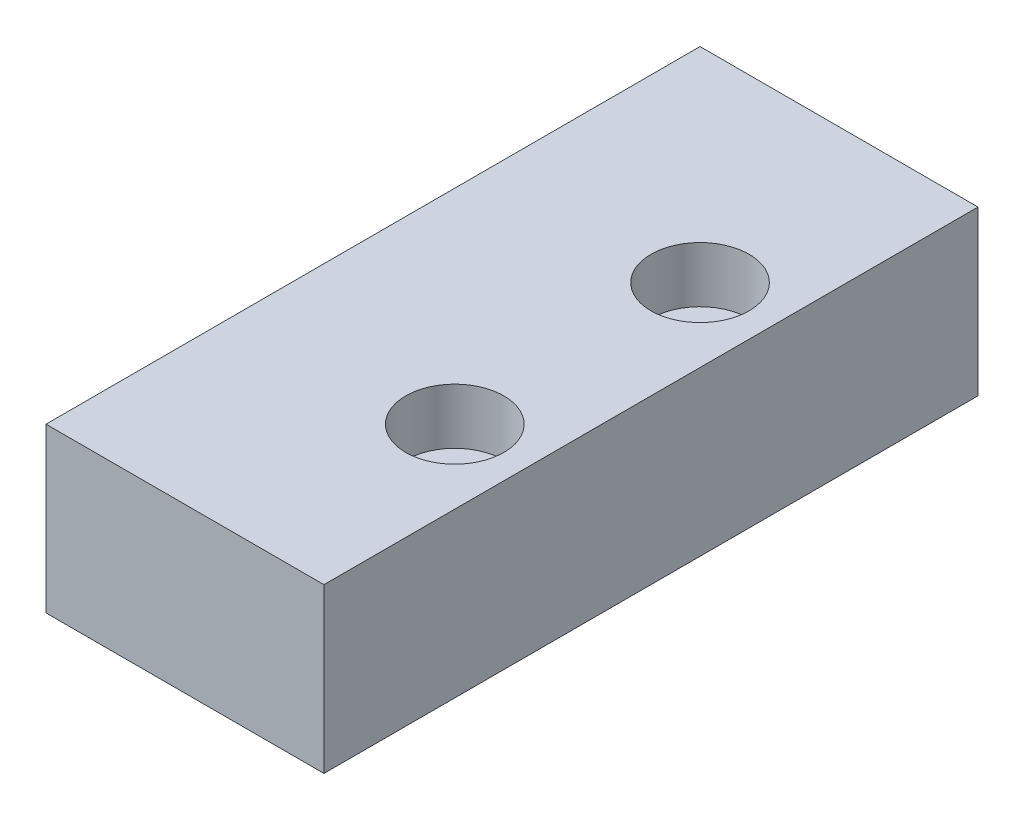
ISO-10303-21;
HEADER;
FILE_DESCRIPTION(('STEP AP214'),'2;1');
FILE_NAME('part.step','',(''),(''),'','','');
FILE_SCHEMA(('AUTOMOTIVE_DESIGN { 1 0 10303 214 1 1 1 1 }'));
ENDSEC;
DATA;
#1=APPLICATION_CONTEXT('core data for automotive mechanical design processes');
#2=APPLICATION_PROTOCOL_DEFINITION('international standard','automotive_design',2000,#1);
#3=PRODUCT_CONTEXT('',#1,'mechanical');
#4=PRODUCT('Part','Part','',(#3));
#5=PRODUCT_RELATED_PRODUCT_CATEGORY('part','',(#4));
#6=PRODUCT_DEFINITION_FORMATION('','',#4);
#7=PRODUCT_DEFINITION_CONTEXT('part definition',#1,'design');
#8=PRODUCT_DEFINITION('design','',#6,#7);
#9=PRODUCT_DEFINITION_SHAPE('','',#8);
#10=(LENGTH_UNIT() NAMED_UNIT(*) SI_UNIT(.MILLI.,.METRE.));
#11=(NAMED_UNIT(*) PLANE_ANGLE_UNIT() SI_UNIT($,.RADIAN.));
#12=(NAMED_UNIT(*) SI_UNIT($,.STERADIAN.) SOLID_ANGLE_UNIT());
#13=UNCERTAINTY_MEASURE_WITH_UNIT(LENGTH_MEASURE(1.E-05),#10,'distance_accuracy_value','');
#14=(GEOMETRIC_REPRESENTATION_CONTEXT(3) GLOBAL_UNCERTAINTY_ASSIGNED_CONTEXT((#13)) GLOBAL_UNIT_ASSIGNED_CONTEXT((#10,
#11,#12)) REPRESENTATION_CONTEXT('',''));
#15=CARTESIAN_POINT('',(0.,0.,0.));
#16=DIRECTION('',(0.,0.,1.));
#17=DIRECTION('',(1.,0.,0.));
#18=AXIS2_PLACEMENT_3D('',#15,#16,#17);
#19=CARTESIAN_POINT('',(0.,10.,0.));
#20=DIRECTION('',(-1.,0.,0.));
#21=DIRECTION('',(0.,0.,1.));
#22=AXIS2_PLACEMENT_3D('',#19,#20,#21);
#23=PLANE('',#22);
#24=DIRECTION('',(0.,0.,-1.));
#25=VECTOR('',#24,1.);
#26=CARTESIAN_POINT('',(0.,0.,0.));
#27=LINE('',#26,#25);
#28=CARTESIAN_POINT('',(0.,0.,20.));
#29=VERTEX_POINT('',#28);
#30=CARTESIAN_POINT('',(0.,0.,-20.));
#31=VERTEX_POINT('',#30);
#32=EDGE_CURVE('E76',#29,#31,#27,.T.);
#33=ORIENTED_EDGE('',*,*,#32,.T.);
#34=DIRECTION('',(0.,-1.,0.));
#35=VECTOR('',#34,1.);
#36=CARTESIAN_POINT('',(0.,10.,-20.));
#37=LINE('',#36,#35);
#38=CARTESIAN_POINT('',(0.,10.,-20.));
#39=VERTEX_POINT('',#38);
#40=EDGE_CURVE('E11',#39,#31,#37,.T.);
#41=ORIENTED_EDGE('',*,*,#40,.F.);
#42=DIRECTION('',(0.,0.,-1.));
#43=VECTOR('',#42,1.);
#44=CARTESIAN_POINT('',(0.,10.,20.));
#45=LINE('',#44,#43);
#46=CARTESIAN_POINT('',(0.,10.,20.));
#47=VERTEX_POINT('',#46);
#48=EDGE_CURVE('E81',#47,#39,#45,.T.);
#49=ORIENTED_EDGE('',*,*,#48,.F.);
#50=DIRECTION('',(0.,-1.,0.));
#51=VECTOR('',#50,1.);
#52=CARTESIAN_POINT('',(0.,10.,20.));
#53=LINE('',#52,#51);
#54=EDGE_CURVE('E150',#47,#29,#53,.T.);
#55=ORIENTED_EDGE('',*,*,#54,.T.);
#56=EDGE_LOOP('',(#33,#41,#49,#55));
#57=FACE_BOUND('',#56,.T.);
#58=ADVANCED_FACE('F35',(#57),#23,.F.);
#59=CARTESIAN_POINT('',(0.,10.,-20.));
#60=DIRECTION('',(0.,0.,1.));
#61=DIRECTION('',(1.,0.,0.));
#62=AXIS2_PLACEMENT_3D('',#59,#60,#61);
#63=PLANE('',#62);
#64=DIRECTION('',(-1.,0.,0.));
#65=VECTOR('',#64,1.);
#66=CARTESIAN_POINT('',(0.,0.,-20.));
#67=LINE('',#66,#65);
#68=CARTESIAN_POINT('',(-17.,0.,-20.));
#69=VERTEX_POINT('',#68);
#70=EDGE_CURVE('E152',#31,#69,#67,.T.);
#71=ORIENTED_EDGE('',*,*,#70,.T.);
#72=DIRECTION('',(0.,-1.,0.));
#73=VECTOR('',#72,1.);
#74=CARTESIAN_POINT('',(-17.,10.,-20.));
#75=LINE('',#74,#73);
#76=CARTESIAN_POINT('',(-17.,10.,-20.));
#77=VERTEX_POINT('',#76);
#78=EDGE_CURVE('E43',#77,#69,#75,.T.);
#79=ORIENTED_EDGE('',*,*,#78,.F.);
#80=DIRECTION('',(-1.,0.,0.));
#81=VECTOR('',#80,1.);
#82=CARTESIAN_POINT('',(0.,10.,-20.));
#83=LINE('',#82,#81);
#84=EDGE_CURVE('E144',#39,#77,#83,.T.);
#85=ORIENTED_EDGE('',*,*,#84,.F.);
#86=ORIENTED_EDGE('',*,*,#40,.T.);
#87=EDGE_LOOP('',(#71,#79,#85,#86));
#88=FACE_BOUND('',#87,.T.);
#89=ADVANCED_FACE('F168',(#88),#63,.F.);
#90=CARTESIAN_POINT('',(-17.,10.,-20.));
#91=DIRECTION('',(1.,0.,0.));
#92=DIRECTION('',(0.,0.,-1.));
#93=AXIS2_PLACEMENT_3D('',#90,#91,#92);
#94=PLANE('',#93);
#95=CARTESIAN_POINT('',(-17.,5.,-12.));
#96=DIRECTION('',(-1.,0.,0.));
#97=DIRECTION('',(0.,0.,1.));
#98=AXIS2_PLACEMENT_3D('',#95,#96,#97);
#99=CIRCLE('',#98,1.24999999999999);
#100=CARTESIAN_POINT('',(-17.,5.,-10.75));
#101=VERTEX_POINT('',#100);
#102=EDGE_CURVE('E103',#101,#101,#99,.T.);
#103=ORIENTED_EDGE('',*,*,#102,.F.);
#104=EDGE_LOOP('',(#103));
#105=FACE_BOUND('',#104,.T.);
#106=CARTESIAN_POINT('',(-17.,5.,0.));
#107=DIRECTION('',(-1.,0.,0.));
#108=DIRECTION('',(0.,0.,1.));
#109=AXIS2_PLACEMENT_3D('',#106,#107,#108);
#110=CIRCLE('',#109,1.24999999999999);
#111=CARTESIAN_POINT('',(-17.,5.,1.24999999999999));
#112=VERTEX_POINT('',#111);
#113=EDGE_CURVE('E102',#112,#112,#110,.T.);
#114=ORIENTED_EDGE('',*,*,#113,.F.);
#115=EDGE_LOOP('',(#114));
#116=FACE_BOUND('',#115,.T.);
#117=CARTESIAN_POINT('',(-17.,5.,12.));
#118=DIRECTION('',(-1.,0.,0.));
#119=DIRECTION('',(0.,0.,1.));
#120=AXIS2_PLACEMENT_3D('',#117,#118,#119);
#121=CIRCLE('',#120,1.24999999999999);
#122=CARTESIAN_POINT('',(-17.,5.,13.25));
#123=VERTEX_POINT('',#122);
#124=EDGE_CURVE('E113',#123,#123,#121,.T.);
#125=ORIENTED_EDGE('',*,*,#124,.F.);
#126=EDGE_LOOP('',(#125));
#127=FACE_BOUND('',#126,.T.);
#128=DIRECTION('',(0.,0.,1.));
#129=VECTOR('',#128,1.);
#130=CARTESIAN_POINT('',(-17.,0.,-20.));
#131=LINE('',#130,#129);
#132=CARTESIAN_POINT('',(-17.,0.,20.));
#133=VERTEX_POINT('',#132);
#134=EDGE_CURVE('E69',#69,#133,#131,.T.);
#135=ORIENTED_EDGE('',*,*,#134,.T.);
#136=DIRECTION('',(0.,-1.,0.));
#137=VECTOR('',#136,1.);
#138=CARTESIAN_POINT('',(-17.,10.,20.));
#139=LINE('',#138,#137);
#140=CARTESIAN_POINT('',(-17.,10.,20.));
#141=VERTEX_POINT('',#140);
#142=EDGE_CURVE('E158',#141,#133,#139,.T.);
#143=ORIENTED_EDGE('',*,*,#142,.F.);
#144=DIRECTION('',(0.,0.,1.));
#145=VECTOR('',#144,1.);
#146=CARTESIAN_POINT('',(-17.,10.,-20.));
#147=LINE('',#146,#145);
#148=EDGE_CURVE('E147',#77,#141,#147,.T.);
#149=ORIENTED_EDGE('',*,*,#148,.F.);
#150=ORIENTED_EDGE('',*,*,#78,.T.);
#151=EDGE_LOOP('',(#135,#143,#149,#150));
#152=FACE_BOUND('',#151,.T.);
#153=ADVANCED_FACE('F161',(#105,#116,#127,#152),#94,.F.);
#154=CARTESIAN_POINT('',(-17.,10.,20.));
#155=DIRECTION('',(0.,0.,-1.));
#156=DIRECTION('',(-1.,0.,0.));
#157=AXIS2_PLACEMENT_3D('',#154,#155,#156);
#158=PLANE('',#157);
#159=DIRECTION('',(1.,0.,0.));
#160=VECTOR('',#159,1.);
#161=CARTESIAN_POINT('',(-17.,0.,20.));
#162=LINE('',#161,#160);
#163=EDGE_CURVE('E145',#133,#29,#162,.T.);
#164=ORIENTED_EDGE('',*,*,#163,.T.);
#165=ORIENTED_EDGE('',*,*,#54,.F.);
#166=DIRECTION('',(1.,0.,0.));
#167=VECTOR('',#166,1.);
#168=CARTESIAN_POINT('',(-17.,10.,20.));
#169=LINE('',#168,#167);
#170=EDGE_CURVE('E51',#141,#47,#169,.T.);
#171=ORIENTED_EDGE('',*,*,#170,.F.);
#172=ORIENTED_EDGE('',*,*,#142,.T.);
#173=EDGE_LOOP('',(#164,#165,#171,#172));
#174=FACE_BOUND('',#173,.T.);
#175=ADVANCED_FACE('F166',(#174),#158,.F.);
#176=CARTESIAN_POINT('',(0.,10.,0.));
#177=DIRECTION('',(0.,1.,0.));
#178=DIRECTION('',(0.,0.,1.));
#179=AXIS2_PLACEMENT_3D('',#176,#177,#178);
#180=PLANE('',#179);
#181=CARTESIAN_POINT('',(-4.5,10.,-7.5));
#182=DIRECTION('',(0.,1.,0.));
#183=DIRECTION('',(0.,0.,1.));
#184=AXIS2_PLACEMENT_3D('',#181,#182,#183);
#185=CIRCLE('',#184,3.);
#186=CARTESIAN_POINT('',(-4.5,10.,-4.5));
#187=VERTEX_POINT('',#186);
#188=EDGE_CURVE('E119',#187,#187,#185,.T.);
#189=ORIENTED_EDGE('',*,*,#188,.F.);
#190=EDGE_LOOP('',(#189));
#191=FACE_BOUND('',#190,.T.);
#192=CARTESIAN_POINT('',(-4.5,10.,7.5));
#193=DIRECTION('',(0.,1.,0.));
#194=DIRECTION('',(0.,0.,1.));
#195=AXIS2_PLACEMENT_3D('',#192,#193,#194);
#196=CIRCLE('',#195,3.);
#197=CARTESIAN_POINT('',(-4.5,10.,10.5));
#198=VERTEX_POINT('',#197);
#199=EDGE_CURVE('E131',#198,#198,#196,.T.);
#200=ORIENTED_EDGE('',*,*,#199,.F.);
#201=EDGE_LOOP('',(#200));
#202=FACE_BOUND('',#201,.T.);
#203=ORIENTED_EDGE('',*,*,#48,.T.);
#204=ORIENTED_EDGE('',*,*,#84,.T.);
#205=ORIENTED_EDGE('',*,*,#148,.T.);
#206=ORIENTED_EDGE('',*,*,#170,.T.);
#207=EDGE_LOOP('',(#203,#204,#205,#206));
#208=FACE_BOUND('',#207,.T.);
#209=ADVANCED_FACE('F169',(#191,#202,#208),#180,.T.);
#210=CARTESIAN_POINT('',(0.,0.,0.));
#211=DIRECTION('',(0.,1.,0.));
#212=DIRECTION('',(0.,0.,1.));
#213=AXIS2_PLACEMENT_3D('',#210,#211,#212);
#214=PLANE('',#213);
#215=CARTESIAN_POINT('',(-4.5,0.,-7.5));
#216=DIRECTION('',(0.,1.,0.));
#217=DIRECTION('',(0.,0.,1.));
#218=AXIS2_PLACEMENT_3D('',#215,#216,#217);
#219=CIRCLE('',#218,1.7);
#220=CARTESIAN_POINT('',(-4.5,0.,-5.8));
#221=VERTEX_POINT('',#220);
#222=EDGE_CURVE('E128',#221,#221,#219,.T.);
#223=ORIENTED_EDGE('',*,*,#222,.T.);
#224=EDGE_LOOP('',(#223));
#225=FACE_BOUND('',#224,.T.);
#226=CARTESIAN_POINT('',(-4.5,0.,7.5));
#227=DIRECTION('',(0.,1.,0.));
#228=DIRECTION('',(0.,0.,1.));
#229=AXIS2_PLACEMENT_3D('',#226,#227,#228);
#230=CIRCLE('',#229,1.7);
#231=CARTESIAN_POINT('',(-4.5,0.,9.2));
#232=VERTEX_POINT('',#231);
#233=EDGE_CURVE('E140',#232,#232,#230,.T.);
#234=ORIENTED_EDGE('',*,*,#233,.T.);
#235=EDGE_LOOP('',(#234));
#236=FACE_BOUND('',#235,.T.);
#237=ORIENTED_EDGE('',*,*,#32,.F.);
#238=ORIENTED_EDGE('',*,*,#163,.F.);
#239=ORIENTED_EDGE('',*,*,#134,.F.);
#240=ORIENTED_EDGE('',*,*,#70,.F.);
#241=EDGE_LOOP('',(#237,#238,#239,#240));
#242=FACE_BOUND('',#241,.T.);
#243=ADVANCED_FACE('F164',(#225,#236,#242),#214,.F.);
#244=CARTESIAN_POINT('',(-4.5,10.,7.5));
#245=DIRECTION('',(0.,1.,0.));
#246=DIRECTION('',(0.,0.,1.));
#247=AXIS2_PLACEMENT_3D('',#244,#245,#246);
#248=CYLINDRICAL_SURFACE('',#247,1.7);
#249=ORIENTED_EDGE('',*,*,#233,.F.);
#250=EDGE_LOOP('',(#249));
#251=FACE_BOUND('',#250,.T.);
#252=CARTESIAN_POINT('',(-4.5,6.6,7.5));
#253=DIRECTION('',(0.,1.,0.));
#254=DIRECTION('',(0.,0.,1.));
#255=AXIS2_PLACEMENT_3D('',#252,#253,#254);
#256=CIRCLE('',#255,1.7);
#257=CARTESIAN_POINT('',(-4.5,6.6,9.2));
#258=VERTEX_POINT('',#257);
#259=EDGE_CURVE('E137',#258,#258,#256,.T.);
#260=ORIENTED_EDGE('',*,*,#259,.T.);
#261=EDGE_LOOP('',(#260));
#262=FACE_BOUND('',#261,.T.);
#263=ADVANCED_FACE('F177',(#251,#262),#248,.F.);
#264=CARTESIAN_POINT('',(-2.8,6.6,7.5));
#265=DIRECTION('',(0.,-1.,0.));
#266=DIRECTION('',(0.,0.,-1.));
#267=AXIS2_PLACEMENT_3D('',#264,#265,#266);
#268=PLANE('',#267);
#269=ORIENTED_EDGE('',*,*,#259,.F.);
#270=EDGE_LOOP('',(#269));
#271=FACE_BOUND('',#270,.T.);
#272=CARTESIAN_POINT('',(-4.5,6.6,7.5));
#273=DIRECTION('',(0.,1.,0.));
#274=DIRECTION('',(0.,0.,1.));
#275=AXIS2_PLACEMENT_3D('',#272,#273,#274);
#276=CIRCLE('',#275,3.);
#277=CARTESIAN_POINT('',(-4.5,6.6,10.5));
#278=VERTEX_POINT('',#277);
#279=EDGE_CURVE('E134',#278,#278,#276,.T.);
#280=ORIENTED_EDGE('',*,*,#279,.T.);
#281=EDGE_LOOP('',(#280));
#282=FACE_BOUND('',#281,.T.);
#283=ADVANCED_FACE('F233',(#271,#282),#268,.F.);
#284=CARTESIAN_POINT('',(-4.5,10.,7.5));
#285=DIRECTION('',(0.,1.,0.));
#286=DIRECTION('',(0.,0.,1.));
#287=AXIS2_PLACEMENT_3D('',#284,#285,#286);
#288=CYLINDRICAL_SURFACE('',#287,3.);
#289=ORIENTED_EDGE('',*,*,#279,.F.);
#290=EDGE_LOOP('',(#289));
#291=FACE_BOUND('',#290,.T.);
#292=ORIENTED_EDGE('',*,*,#199,.T.);
#293=EDGE_LOOP('',(#292));
#294=FACE_BOUND('',#293,.T.);
#295=ADVANCED_FACE('F229',(#291,#294),#288,.F.);
#296=CARTESIAN_POINT('',(-4.5,10.,-7.5));
#297=DIRECTION('',(0.,1.,0.));
#298=DIRECTION('',(0.,0.,1.));
#299=AXIS2_PLACEMENT_3D('',#296,#297,#298);
#300=CYLINDRICAL_SURFACE('',#299,1.7);
#301=ORIENTED_EDGE('',*,*,#222,.F.);
#302=EDGE_LOOP('',(#301));
#303=FACE_BOUND('',#302,.T.);
#304=CARTESIAN_POINT('',(-4.5,6.6,-7.5));
#305=DIRECTION('',(0.,1.,0.));
#306=DIRECTION('',(0.,0.,1.));
#307=AXIS2_PLACEMENT_3D('',#304,#305,#306);
#308=CIRCLE('',#307,1.7);
#309=CARTESIAN_POINT('',(-4.5,6.6,-5.8));
#310=VERTEX_POINT('',#309);
#311=EDGE_CURVE('E125',#310,#310,#308,.T.);
#312=ORIENTED_EDGE('',*,*,#311,.T.);
#313=EDGE_LOOP('',(#312));
#314=FACE_BOUND('',#313,.T.);
#315=ADVANCED_FACE('F225',(#303,#314),#300,.F.);
#316=CARTESIAN_POINT('',(-2.8,6.6,-7.5));
#317=DIRECTION('',(0.,-1.,0.));
#318=DIRECTION('',(0.,0.,-1.));
#319=AXIS2_PLACEMENT_3D('',#316,#317,#318);
#320=PLANE('',#319);
#321=ORIENTED_EDGE('',*,*,#311,.F.);
#322=EDGE_LOOP('',(#321));
#323=FACE_BOUND('',#322,.T.);
#324=CARTESIAN_POINT('',(-4.5,6.6,-7.5));
#325=DIRECTION('',(0.,1.,0.));
#326=DIRECTION('',(0.,0.,1.));
#327=AXIS2_PLACEMENT_3D('',#324,#325,#326);
#328=CIRCLE('',#327,3.);
#329=CARTESIAN_POINT('',(-4.5,6.6,-4.5));
#330=VERTEX_POINT('',#329);
#331=EDGE_CURVE('E122',#330,#330,#328,.T.);
#332=ORIENTED_EDGE('',*,*,#331,.T.);
#333=EDGE_LOOP('',(#332));
#334=FACE_BOUND('',#333,.T.);
#335=ADVANCED_FACE('F221',(#323,#334),#320,.F.);
#336=CARTESIAN_POINT('',(-4.5,10.,-7.5));
#337=DIRECTION('',(0.,1.,0.));
#338=DIRECTION('',(0.,0.,1.));
#339=AXIS2_PLACEMENT_3D('',#336,#337,#338);
#340=CYLINDRICAL_SURFACE('',#339,3.);
#341=ORIENTED_EDGE('',*,*,#331,.F.);
#342=EDGE_LOOP('',(#341));
#343=FACE_BOUND('',#342,.T.);
#344=ORIENTED_EDGE('',*,*,#188,.T.);
#345=EDGE_LOOP('',(#344));
#346=FACE_BOUND('',#345,.T.);
#347=ADVANCED_FACE('F213',(#343,#346),#340,.F.);
#348=CARTESIAN_POINT('',(-9.50000000000001,5.,12.));
#349=DIRECTION('',(-1.,0.,0.));
#350=DIRECTION('',(0.,0.,1.));
#351=AXIS2_PLACEMENT_3D('',#348,#349,#350);
#352=CONICAL_SURFACE('',#351,1.24999999999999,1.02974425867664);
#353=CARTESIAN_POINT('',(-8.74892422621555,5.,12.));
#354=VERTEX_POINT('',#353);
#355=VERTEX_LOOP('',#354);
#356=FACE_BOUND('',#355,.T.);
#357=CARTESIAN_POINT('',(-9.50000000000001,5.,12.));
#358=DIRECTION('',(-1.,0.,0.));
#359=DIRECTION('',(0.,0.,1.));
#360=AXIS2_PLACEMENT_3D('',#357,#358,#359);
#361=CIRCLE('',#360,1.24999999999999);
#362=CARTESIAN_POINT('',(-9.50000000000001,5.,13.25));
#363=VERTEX_POINT('',#362);
#364=EDGE_CURVE('E116',#363,#363,#361,.T.);
#365=ORIENTED_EDGE('',*,*,#364,.T.);
#366=EDGE_LOOP('',(#365));
#367=FACE_BOUND('',#366,.T.);
#368=ADVANCED_FACE('F204',(#356,#367),#352,.F.);
#369=CARTESIAN_POINT('',(-17.,5.,12.));
#370=DIRECTION('',(-1.,0.,0.));
#371=DIRECTION('',(0.,0.,1.));
#372=AXIS2_PLACEMENT_3D('',#369,#370,#371);
#373=CYLINDRICAL_SURFACE('',#372,1.24999999999999);
#374=ORIENTED_EDGE('',*,*,#364,.F.);
#375=EDGE_LOOP('',(#374));
#376=FACE_BOUND('',#375,.T.);
#377=ORIENTED_EDGE('',*,*,#124,.T.);
#378=EDGE_LOOP('',(#377));
#379=FACE_BOUND('',#378,.T.);
#380=ADVANCED_FACE('F201',(#376,#379),#373,.F.);
#381=CARTESIAN_POINT('',(-9.50000000000001,5.,0.));
#382=DIRECTION('',(-1.,0.,0.));
#383=DIRECTION('',(0.,0.,1.));
#384=AXIS2_PLACEMENT_3D('',#381,#382,#383);
#385=CONICAL_SURFACE('',#384,1.24999999999999,1.02974425867664);
#386=CARTESIAN_POINT('',(-8.74892422621555,5.,0.));
#387=VERTEX_POINT('',#386);
#388=VERTEX_LOOP('',#387);
#389=FACE_BOUND('',#388,.T.);
#390=CARTESIAN_POINT('',(-9.50000000000001,5.,0.));
#391=DIRECTION('',(-1.,0.,0.));
#392=DIRECTION('',(0.,0.,1.));
#393=AXIS2_PLACEMENT_3D('',#390,#391,#392);
#394=CIRCLE('',#393,1.24999999999999);
#395=CARTESIAN_POINT('',(-9.50000000000001,5.,1.24999999999999));
#396=VERTEX_POINT('',#395);
#397=EDGE_CURVE('E106',#396,#396,#394,.T.);
#398=ORIENTED_EDGE('',*,*,#397,.T.);
#399=EDGE_LOOP('',(#398));
#400=FACE_BOUND('',#399,.T.);
#401=ADVANCED_FACE('F203',(#389,#400),#385,.F.);
#402=CARTESIAN_POINT('',(-17.,5.,0.));
#403=DIRECTION('',(-1.,0.,0.));
#404=DIRECTION('',(0.,0.,1.));
#405=AXIS2_PLACEMENT_3D('',#402,#403,#404);
#406=CYLINDRICAL_SURFACE('',#405,1.24999999999999);
#407=ORIENTED_EDGE('',*,*,#397,.F.);
#408=EDGE_LOOP('',(#407));
#409=FACE_BOUND('',#408,.T.);
#410=ORIENTED_EDGE('',*,*,#113,.T.);
#411=EDGE_LOOP('',(#410));
#412=FACE_BOUND('',#411,.T.);
#413=ADVANCED_FACE('F96',(#409,#412),#406,.F.);
#414=CARTESIAN_POINT('',(-9.50000000000001,5.,-12.));
#415=DIRECTION('',(-1.,0.,0.));
#416=DIRECTION('',(0.,0.,1.));
#417=AXIS2_PLACEMENT_3D('',#414,#415,#416);
#418=CONICAL_SURFACE('',#417,1.24999999999999,1.02974425867664);
#419=CARTESIAN_POINT('',(-8.74892422621555,5.,-12.));
#420=VERTEX_POINT('',#419);
#421=VERTEX_LOOP('',#420);
#422=FACE_BOUND('',#421,.T.);
#423=CARTESIAN_POINT('',(-9.50000000000001,5.,-12.));
#424=DIRECTION('',(-1.,0.,0.));
#425=DIRECTION('',(0.,0.,1.));
#426=AXIS2_PLACEMENT_3D('',#423,#424,#425);
#427=CIRCLE('',#426,1.24999999999999);
#428=CARTESIAN_POINT('',(-9.50000000000001,5.,-10.75));
#429=VERTEX_POINT('',#428);
#430=EDGE_CURVE('E100',#429,#429,#427,.T.);
#431=ORIENTED_EDGE('',*,*,#430,.T.);
#432=EDGE_LOOP('',(#431));
#433=FACE_BOUND('',#432,.T.);
#434=ADVANCED_FACE('F92',(#422,#433),#418,.F.);
#435=CARTESIAN_POINT('',(-17.,5.,-12.));
#436=DIRECTION('',(-1.,0.,0.));
#437=DIRECTION('',(0.,0.,1.));
#438=AXIS2_PLACEMENT_3D('',#435,#436,#437);
#439=CYLINDRICAL_SURFACE('',#438,1.24999999999999);
#440=ORIENTED_EDGE('',*,*,#430,.F.);
#441=EDGE_LOOP('',(#440));
#442=FACE_BOUND('',#441,.T.);
#443=ORIENTED_EDGE('',*,*,#102,.T.);
#444=EDGE_LOOP('',(#443));
#445=FACE_BOUND('',#444,.T.);
#446=ADVANCED_FACE('F95',(#442,#445),#439,.F.);
#447=CLOSED_SHELL('',(#58,#89,#153,#175,#209,#243,#263,#283,#295,#315,#335,#347,#368,#380,#401,
#413,#434,#446));
#448=MANIFOLD_SOLID_BREP('B2',#447);
#449=ADVANCED_BREP_SHAPE_REPRESENTATION('',(#18,#448),#14);
#450=SHAPE_DEFINITION_REPRESENTATION(#9,#449);
ENDSEC;
END-ISO-10303-21;
